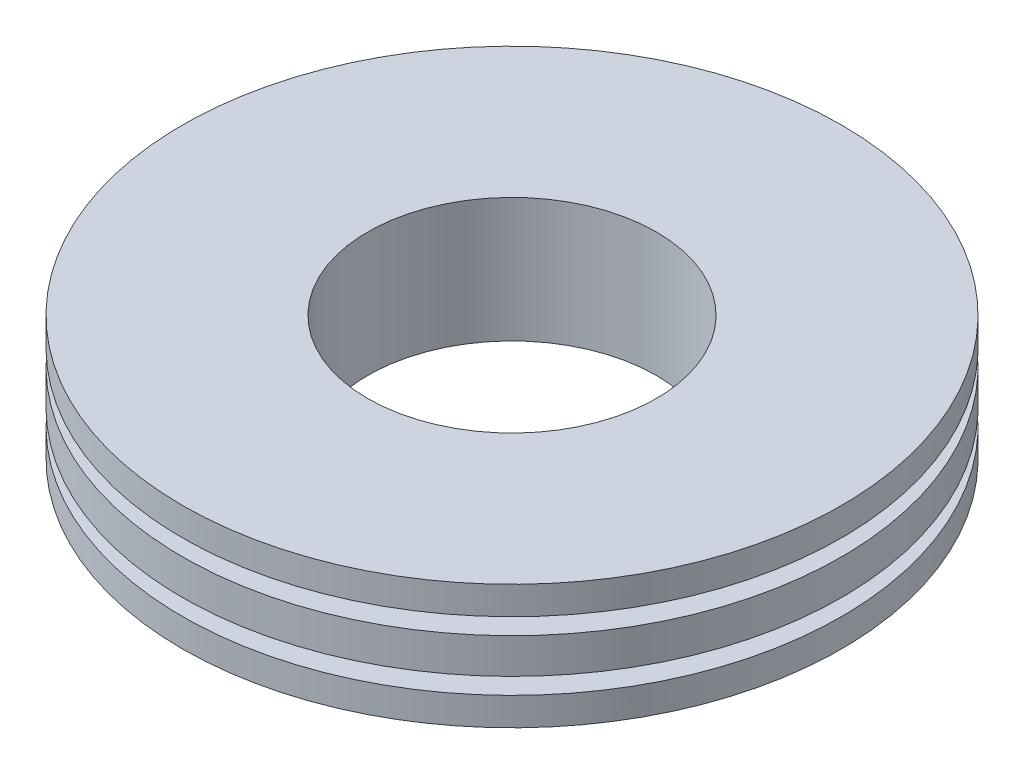
ISO-10303-21;
HEADER;
FILE_DESCRIPTION(('STEP AP214'),'2;1');
FILE_NAME('part.step','',(''),(''),'','','');
FILE_SCHEMA(('AUTOMOTIVE_DESIGN { 1 0 10303 214 1 1 1 1 }'));
ENDSEC;
DATA;
#1=APPLICATION_CONTEXT('core data for automotive mechanical design processes');
#2=APPLICATION_PROTOCOL_DEFINITION('international standard','automotive_design',2000,#1);
#3=PRODUCT_CONTEXT('',#1,'mechanical');
#4=PRODUCT('Part','Part','',(#3));
#5=PRODUCT_RELATED_PRODUCT_CATEGORY('part','',(#4));
#6=PRODUCT_DEFINITION_FORMATION('','',#4);
#7=PRODUCT_DEFINITION_CONTEXT('part definition',#1,'design');
#8=PRODUCT_DEFINITION('design','',#6,#7);
#9=PRODUCT_DEFINITION_SHAPE('','',#8);
#10=(LENGTH_UNIT() NAMED_UNIT(*) SI_UNIT(.MILLI.,.METRE.));
#11=(NAMED_UNIT(*) PLANE_ANGLE_UNIT() SI_UNIT($,.RADIAN.));
#12=(NAMED_UNIT(*) SI_UNIT($,.STERADIAN.) SOLID_ANGLE_UNIT());
#13=UNCERTAINTY_MEASURE_WITH_UNIT(LENGTH_MEASURE(1.E-05),#10,'distance_accuracy_value','');
#14=(GEOMETRIC_REPRESENTATION_CONTEXT(3) GLOBAL_UNCERTAINTY_ASSIGNED_CONTEXT((#13)) GLOBAL_UNIT_ASSIGNED_CONTEXT((#10,
#11,#12)) REPRESENTATION_CONTEXT('',''));
#15=CARTESIAN_POINT('',(0.,0.,0.));
#16=DIRECTION('',(0.,0.,1.));
#17=DIRECTION('',(1.,0.,0.));
#18=AXIS2_PLACEMENT_3D('',#15,#16,#17);
#19=CARTESIAN_POINT('',(0.,3.54,0.));
#20=DIRECTION('',(0.,-1.,0.));
#21=DIRECTION('',(0.,0.,-1.));
#22=AXIS2_PLACEMENT_3D('',#19,#20,#21);
#23=CYLINDRICAL_SURFACE('',#22,9.385);
#24=CARTESIAN_POINT('',(0.,0.8,0.));
#25=DIRECTION('',(0.,-1.,0.));
#26=DIRECTION('',(0.,0.,-1.));
#27=AXIS2_PLACEMENT_3D('',#24,#25,#26);
#28=CIRCLE('',#27,9.385);
#29=CARTESIAN_POINT('',(0.,0.8,-9.385));
#30=VERTEX_POINT('',#29);
#31=EDGE_CURVE('E65',#30,#30,#28,.T.);
#32=ORIENTED_EDGE('',*,*,#31,.T.);
#33=EDGE_LOOP('',(#32));
#34=FACE_BOUND('',#33,.T.);
#35=CARTESIAN_POINT('',(0.,0.,0.));
#36=DIRECTION('',(0.,1.,0.));
#37=DIRECTION('',(0.,0.,1.));
#38=AXIS2_PLACEMENT_3D('',#35,#36,#37);
#39=CIRCLE('',#38,9.385);
#40=CARTESIAN_POINT('',(0.,0.,9.385));
#41=VERTEX_POINT('',#40);
#42=EDGE_CURVE('E50',#41,#41,#39,.T.);
#43=ORIENTED_EDGE('',*,*,#42,.T.);
#44=EDGE_LOOP('',(#43));
#45=FACE_BOUND('',#44,.T.);
#46=ADVANCED_FACE('F43',(#34,#45),#23,.T.);
#47=CARTESIAN_POINT('',(0.,3.54,0.));
#48=DIRECTION('',(0.,1.,0.));
#49=DIRECTION('',(0.,0.,1.));
#50=AXIS2_PLACEMENT_3D('',#47,#48,#49);
#51=PLANE('',#50);
#52=CARTESIAN_POINT('',(0.,3.54,0.));
#53=DIRECTION('',(0.,1.,0.));
#54=DIRECTION('',(0.,0.,1.));
#55=AXIS2_PLACEMENT_3D('',#52,#53,#54);
#56=CIRCLE('',#55,9.385);
#57=CARTESIAN_POINT('',(0.,3.54,9.385));
#58=VERTEX_POINT('',#57);
#59=EDGE_CURVE('E10',#58,#58,#56,.T.);
#60=ORIENTED_EDGE('',*,*,#59,.T.);
#61=EDGE_LOOP('',(#60));
#62=FACE_BOUND('',#61,.T.);
#63=CARTESIAN_POINT('',(0.,3.54,0.));
#64=DIRECTION('',(0.,1.,0.));
#65=DIRECTION('',(0.,0.,1.));
#66=AXIS2_PLACEMENT_3D('',#63,#64,#65);
#67=CIRCLE('',#66,4.11);
#68=CARTESIAN_POINT('',(0.,3.54,4.11));
#69=VERTEX_POINT('',#68);
#70=EDGE_CURVE('E57',#69,#69,#67,.T.);
#71=ORIENTED_EDGE('',*,*,#70,.F.);
#72=EDGE_LOOP('',(#71));
#73=FACE_BOUND('',#72,.T.);
#74=ADVANCED_FACE('F133',(#62,#73),#51,.T.);
#75=CARTESIAN_POINT('',(0.,0.,0.));
#76=DIRECTION('',(0.,1.,0.));
#77=DIRECTION('',(0.,0.,1.));
#78=AXIS2_PLACEMENT_3D('',#75,#76,#77);
#79=PLANE('',#78);
#80=ORIENTED_EDGE('',*,*,#42,.F.);
#81=EDGE_LOOP('',(#80));
#82=FACE_BOUND('',#81,.T.);
#83=CARTESIAN_POINT('',(0.,0.,0.));
#84=DIRECTION('',(0.,1.,0.));
#85=DIRECTION('',(0.,0.,1.));
#86=AXIS2_PLACEMENT_3D('',#83,#84,#85);
#87=CIRCLE('',#86,4.11);
#88=CARTESIAN_POINT('',(0.,0.,4.11));
#89=VERTEX_POINT('',#88);
#90=EDGE_CURVE('E59',#89,#89,#87,.T.);
#91=ORIENTED_EDGE('',*,*,#90,.T.);
#92=EDGE_LOOP('',(#91));
#93=FACE_BOUND('',#92,.T.);
#94=ADVANCED_FACE('F130',(#82,#93),#79,.F.);
#95=CARTESIAN_POINT('',(0.,2.74,0.));
#96=DIRECTION('',(0.,-1.,0.));
#97=DIRECTION('',(0.,0.,-1.));
#98=AXIS2_PLACEMENT_3D('',#95,#96,#97);
#99=CIRCLE('',#98,9.385);
#100=CARTESIAN_POINT('',(0.,2.74,-9.385));
#101=VERTEX_POINT('',#100);
#102=EDGE_CURVE('E72',#101,#101,#99,.T.);
#103=ORIENTED_EDGE('',*,*,#102,.F.);
#104=EDGE_LOOP('',(#103));
#105=FACE_BOUND('',#104,.T.);
#106=ORIENTED_EDGE('',*,*,#59,.F.);
#107=EDGE_LOOP('',(#106));
#108=FACE_BOUND('',#107,.T.);
#109=ADVANCED_FACE('F44',(#105,#108),#23,.T.);
#110=CARTESIAN_POINT('',(0.,3.54,0.));
#111=DIRECTION('',(0.,-1.,0.));
#112=DIRECTION('',(0.,0.,-1.));
#113=AXIS2_PLACEMENT_3D('',#110,#111,#112);
#114=CYLINDRICAL_SURFACE('',#113,4.11);
#115=ORIENTED_EDGE('',*,*,#70,.T.);
#116=EDGE_LOOP('',(#115));
#117=FACE_BOUND('',#116,.T.);
#118=ORIENTED_EDGE('',*,*,#90,.F.);
#119=EDGE_LOOP('',(#118));
#120=FACE_BOUND('',#119,.T.);
#121=ADVANCED_FACE('F112',(#117,#120),#114,.F.);
#122=CARTESIAN_POINT('',(7.61008844711985,2.27234093341722,0.));
#123=DIRECTION('',(0.,-1.,0.));
#124=DIRECTION('',(0.,0.,-1.));
#125=AXIS2_PLACEMENT_3D('',#122,#123,#124);
#126=PLANE('',#125);
#127=CARTESIAN_POINT('',(0.,2.27234093341722,0.));
#128=DIRECTION('',(0.,-1.,0.));
#129=DIRECTION('',(0.,0.,-1.));
#130=AXIS2_PLACEMENT_3D('',#127,#128,#129);
#131=CIRCLE('',#130,9.385);
#132=CARTESIAN_POINT('',(0.,2.27234093341722,-9.385));
#133=VERTEX_POINT('',#132);
#134=EDGE_CURVE('E68',#133,#133,#131,.T.);
#135=ORIENTED_EDGE('',*,*,#134,.F.);
#136=EDGE_LOOP('',(#135));
#137=FACE_BOUND('',#136,.T.);
#138=CARTESIAN_POINT('',(0.,2.27234093341722,0.));
#139=DIRECTION('',(0.,-1.,0.));
#140=DIRECTION('',(0.,0.,-1.));
#141=AXIS2_PLACEMENT_3D('',#138,#139,#140);
#142=CIRCLE('',#141,7.61008844711985);
#143=CARTESIAN_POINT('',(0.,2.27234093341722,-7.61008844711985));
#144=VERTEX_POINT('',#143);
#145=EDGE_CURVE('E76',#144,#144,#142,.T.);
#146=ORIENTED_EDGE('',*,*,#145,.T.);
#147=EDGE_LOOP('',(#146));
#148=FACE_BOUND('',#147,.T.);
#149=ADVANCED_FACE('F110',(#137,#148),#126,.F.);
#150=CARTESIAN_POINT('',(9.385,2.74,0.));
#151=DIRECTION('',(0.,1.,0.));
#152=DIRECTION('',(0.,0.,1.));
#153=AXIS2_PLACEMENT_3D('',#150,#151,#152);
#154=PLANE('',#153);
#155=CARTESIAN_POINT('',(0.,2.74,0.));
#156=DIRECTION('',(0.,-1.,0.));
#157=DIRECTION('',(0.,0.,-1.));
#158=AXIS2_PLACEMENT_3D('',#155,#156,#157);
#159=CIRCLE('',#158,7.61008844711985);
#160=CARTESIAN_POINT('',(0.,2.74,-7.61008844711985));
#161=VERTEX_POINT('',#160);
#162=EDGE_CURVE('E73',#161,#161,#159,.T.);
#163=ORIENTED_EDGE('',*,*,#162,.F.);
#164=EDGE_LOOP('',(#163));
#165=FACE_BOUND('',#164,.T.);
#166=ORIENTED_EDGE('',*,*,#102,.T.);
#167=EDGE_LOOP('',(#166));
#168=FACE_BOUND('',#167,.T.);
#169=ADVANCED_FACE('F109',(#165,#168),#154,.F.);
#170=CARTESIAN_POINT('',(0.,0.,0.));
#171=DIRECTION('',(0.,-1.,0.));
#172=DIRECTION('',(0.,0.,-1.));
#173=AXIS2_PLACEMENT_3D('',#170,#171,#172);
#174=CYLINDRICAL_SURFACE('',#173,7.61008844711985);
#175=ORIENTED_EDGE('',*,*,#145,.F.);
#176=EDGE_LOOP('',(#175));
#177=FACE_BOUND('',#176,.T.);
#178=ORIENTED_EDGE('',*,*,#162,.T.);
#179=EDGE_LOOP('',(#178));
#180=FACE_BOUND('',#179,.T.);
#181=ADVANCED_FACE('F102',(#177,#180),#174,.T.);
#182=CARTESIAN_POINT('',(0.,1.26765906658278,0.));
#183=DIRECTION('',(0.,-1.,0.));
#184=DIRECTION('',(0.,0.,-1.));
#185=AXIS2_PLACEMENT_3D('',#182,#183,#184);
#186=CIRCLE('',#185,9.385);
#187=CARTESIAN_POINT('',(0.,1.26765906658278,-9.385));
#188=VERTEX_POINT('',#187);
#189=EDGE_CURVE('E66',#188,#188,#186,.T.);
#190=ORIENTED_EDGE('',*,*,#189,.F.);
#191=EDGE_LOOP('',(#190));
#192=FACE_BOUND('',#191,.T.);
#193=ORIENTED_EDGE('',*,*,#134,.T.);
#194=EDGE_LOOP('',(#193));
#195=FACE_BOUND('',#194,.T.);
#196=ADVANCED_FACE('F99',(#192,#195),#23,.T.);
#197=CARTESIAN_POINT('',(9.385,0.8,0.));
#198=DIRECTION('',(0.,-1.,0.));
#199=DIRECTION('',(0.,0.,-1.));
#200=AXIS2_PLACEMENT_3D('',#197,#198,#199);
#201=PLANE('',#200);
#202=ORIENTED_EDGE('',*,*,#31,.F.);
#203=EDGE_LOOP('',(#202));
#204=FACE_BOUND('',#203,.T.);
#205=CARTESIAN_POINT('',(0.,0.8,0.));
#206=DIRECTION('',(0.,-1.,0.));
#207=DIRECTION('',(0.,0.,-1.));
#208=AXIS2_PLACEMENT_3D('',#205,#206,#207);
#209=CIRCLE('',#208,7.61008844711985);
#210=CARTESIAN_POINT('',(0.,0.8,-7.61008844711985));
#211=VERTEX_POINT('',#210);
#212=EDGE_CURVE('E88',#211,#211,#209,.T.);
#213=ORIENTED_EDGE('',*,*,#212,.T.);
#214=EDGE_LOOP('',(#213));
#215=FACE_BOUND('',#214,.T.);
#216=ADVANCED_FACE('F103',(#204,#215),#201,.F.);
#217=CARTESIAN_POINT('',(0.,0.,0.));
#218=DIRECTION('',(0.,-1.,0.));
#219=DIRECTION('',(0.,0.,-1.));
#220=AXIS2_PLACEMENT_3D('',#217,#218,#219);
#221=CYLINDRICAL_SURFACE('',#220,7.61008844711985);
#222=ORIENTED_EDGE('',*,*,#212,.F.);
#223=EDGE_LOOP('',(#222));
#224=FACE_BOUND('',#223,.T.);
#225=CARTESIAN_POINT('',(0.,1.26765906658278,0.));
#226=DIRECTION('',(0.,-1.,0.));
#227=DIRECTION('',(0.,0.,-1.));
#228=AXIS2_PLACEMENT_3D('',#225,#226,#227);
#229=CIRCLE('',#228,7.61008844711985);
#230=CARTESIAN_POINT('',(0.,1.26765906658278,-7.61008844711985));
#231=VERTEX_POINT('',#230);
#232=EDGE_CURVE('E89',#231,#231,#229,.T.);
#233=ORIENTED_EDGE('',*,*,#232,.T.);
#234=EDGE_LOOP('',(#233));
#235=FACE_BOUND('',#234,.T.);
#236=ADVANCED_FACE('F151',(#224,#235),#221,.T.);
#237=CARTESIAN_POINT('',(7.61008844711985,1.26765906658278,0.));
#238=DIRECTION('',(0.,1.,0.));
#239=DIRECTION('',(0.,0.,1.));
#240=AXIS2_PLACEMENT_3D('',#237,#238,#239);
#241=PLANE('',#240);
#242=ORIENTED_EDGE('',*,*,#232,.F.);
#243=EDGE_LOOP('',(#242));
#244=FACE_BOUND('',#243,.T.);
#245=ORIENTED_EDGE('',*,*,#189,.T.);
#246=EDGE_LOOP('',(#245));
#247=FACE_BOUND('',#246,.T.);
#248=ADVANCED_FACE('F98',(#244,#247),#241,.F.);
#249=CLOSED_SHELL('',(#46,#74,#94,#109,#121,#149,#169,#181,#196,#216,#236,#248));
#250=MANIFOLD_SOLID_BREP('B2',#249);
#251=ADVANCED_BREP_SHAPE_REPRESENTATION('',(#18,#250),#14);
#252=SHAPE_DEFINITION_REPRESENTATION(#9,#251);
ENDSEC;
END-ISO-10303-21;
